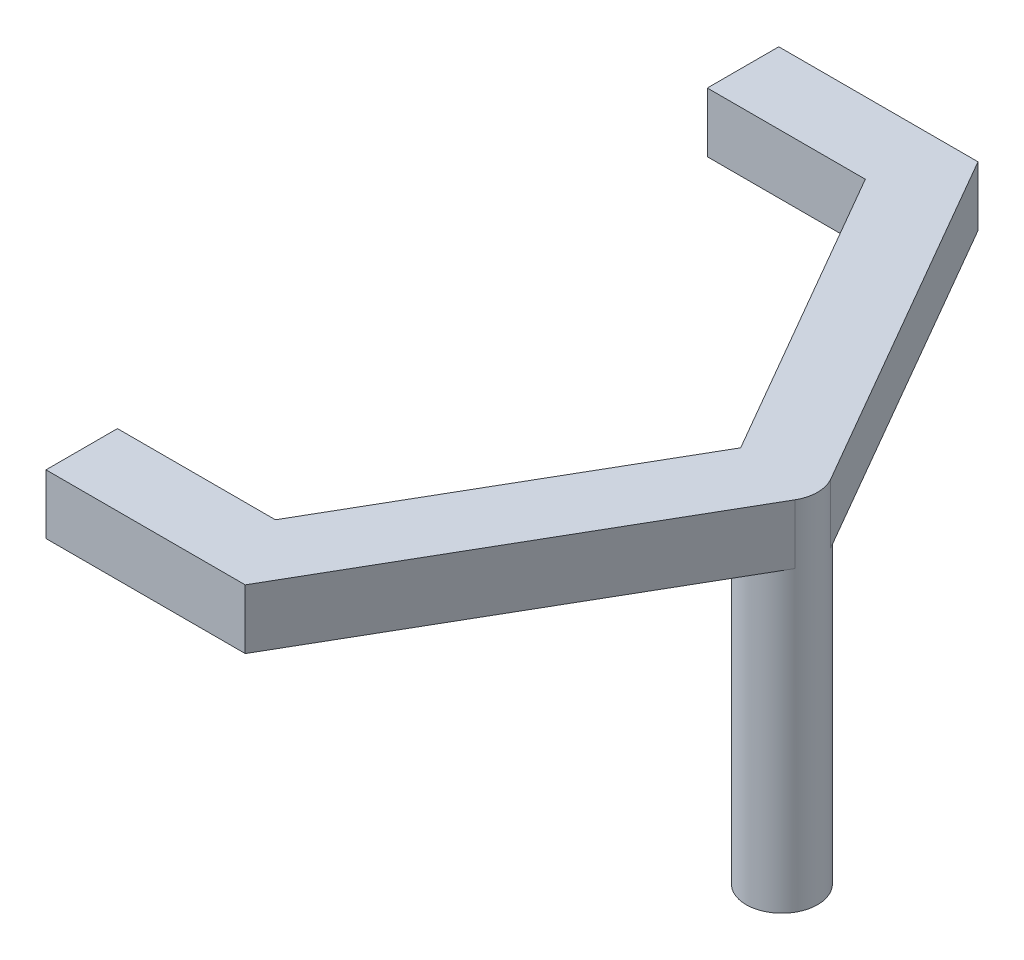
ISO-10303-21;
HEADER;
FILE_DESCRIPTION(('STEP AP214'),'2;1');
FILE_NAME('part.step','',(''),(''),'','','');
FILE_SCHEMA(('AUTOMOTIVE_DESIGN { 1 0 10303 214 1 1 1 1 }'));
ENDSEC;
DATA;
#1=APPLICATION_CONTEXT('core data for automotive mechanical design processes');
#2=APPLICATION_PROTOCOL_DEFINITION('international standard','automotive_design',2000,#1);
#3=PRODUCT_CONTEXT('',#1,'mechanical');
#4=PRODUCT('Part','Part','',(#3));
#5=PRODUCT_RELATED_PRODUCT_CATEGORY('part','',(#4));
#6=PRODUCT_DEFINITION_FORMATION('','',#4);
#7=PRODUCT_DEFINITION_CONTEXT('part definition',#1,'design');
#8=PRODUCT_DEFINITION('design','',#6,#7);
#9=PRODUCT_DEFINITION_SHAPE('','',#8);
#10=(LENGTH_UNIT() NAMED_UNIT(*) SI_UNIT(.MILLI.,.METRE.));
#11=(NAMED_UNIT(*) PLANE_ANGLE_UNIT() SI_UNIT($,.RADIAN.));
#12=(NAMED_UNIT(*) SI_UNIT($,.STERADIAN.) SOLID_ANGLE_UNIT());
#13=UNCERTAINTY_MEASURE_WITH_UNIT(LENGTH_MEASURE(1.E-05),#10,'distance_accuracy_value','');
#14=(GEOMETRIC_REPRESENTATION_CONTEXT(3) GLOBAL_UNCERTAINTY_ASSIGNED_CONTEXT((#13)) GLOBAL_UNIT_ASSIGNED_CONTEXT((#10,
#11,#12)) REPRESENTATION_CONTEXT('',''));
#15=CARTESIAN_POINT('',(0.,0.,0.));
#16=DIRECTION('',(0.,0.,1.));
#17=DIRECTION('',(1.,0.,0.));
#18=AXIS2_PLACEMENT_3D('',#15,#16,#17);
#19=CARTESIAN_POINT('',(-2.59807621135331,25.,1.50000000000001));
#20=DIRECTION('',(-0.866025403784436,0.,0.500000000000004));
#21=DIRECTION('',(0.500000000000004,0.,0.866025403784436));
#22=AXIS2_PLACEMENT_3D('',#19,#20,#21);
#23=PLANE('',#22);
#24=DIRECTION('',(0.500000000000004,0.,0.866025403784436));
#25=VECTOR('',#24,1.);
#26=CARTESIAN_POINT('',(-2.59807621135331,25.,1.50000000000001));
#27=LINE('',#26,#25);
#28=CARTESIAN_POINT('',(-17.765067782965,25.,-24.77));
#29=VERTEX_POINT('',#28);
#30=CARTESIAN_POINT('',(-3.46410161513777,25.,0.));
#31=VERTEX_POINT('',#30);
#32=EDGE_CURVE('E120',#29,#31,#27,.T.);
#33=ORIENTED_EDGE('',*,*,#32,.T.);
#34=DIRECTION('',(0.,1.,0.));
#35=VECTOR('',#34,1.);
#36=CARTESIAN_POINT('',(-3.46410161513777,25.,0.));
#37=LINE('',#36,#35);
#38=CARTESIAN_POINT('',(-3.46410161513777,30.,0.));
#39=VERTEX_POINT('',#38);
#40=EDGE_CURVE('E126',#31,#39,#37,.T.);
#41=ORIENTED_EDGE('',*,*,#40,.T.);
#42=DIRECTION('',(0.500000000000004,0.,0.866025403784436));
#43=VECTOR('',#42,1.);
#44=CARTESIAN_POINT('',(-2.59807621135331,30.,1.50000000000001));
#45=LINE('',#44,#43);
#46=CARTESIAN_POINT('',(-17.765067782965,30.,-24.77));
#47=VERTEX_POINT('',#46);
#48=EDGE_CURVE('E115',#47,#39,#45,.T.);
#49=ORIENTED_EDGE('',*,*,#48,.F.);
#50=DIRECTION('',(0.,1.,0.));
#51=VECTOR('',#50,1.);
#52=CARTESIAN_POINT('',(-17.765067782965,25.,-24.77));
#53=LINE('',#52,#51);
#54=EDGE_CURVE('E52',#29,#47,#53,.T.);
#55=ORIENTED_EDGE('',*,*,#54,.F.);
#56=EDGE_LOOP('',(#33,#41,#49,#55));
#57=FACE_BOUND('',#56,.T.);
#58=ADVANCED_FACE('F35',(#57),#23,.T.);
#59=CARTESIAN_POINT('',(0.,30.,0.));
#60=DIRECTION('',(0.,-1.,0.));
#61=DIRECTION('',(0.,0.,-1.));
#62=AXIS2_PLACEMENT_3D('',#59,#60,#61);
#63=CYLINDRICAL_SURFACE('',#62,3.);
#64=CARTESIAN_POINT('',(0.,30.,0.));
#65=DIRECTION('',(0.,1.,0.));
#66=DIRECTION('',(0.,0.,1.));
#67=AXIS2_PLACEMENT_3D('',#64,#65,#66);
#68=CIRCLE('',#67,3.);
#69=CARTESIAN_POINT('',(2.59807621135331,30.,1.50000000000001));
#70=VERTEX_POINT('',#69);
#71=CARTESIAN_POINT('',(2.59807621135331,30.,-1.50000000000001));
#72=VERTEX_POINT('',#71);
#73=EDGE_CURVE('E44',#70,#72,#68,.T.);
#74=ORIENTED_EDGE('',*,*,#73,.F.);
#75=DIRECTION('',(0.,1.,0.));
#76=VECTOR('',#75,1.);
#77=CARTESIAN_POINT('',(2.59807621135331,25.,1.50000000000001));
#78=LINE('',#77,#76);
#79=CARTESIAN_POINT('',(2.59807621135331,25.,1.50000000000001));
#80=VERTEX_POINT('',#79);
#81=EDGE_CURVE('E178',#80,#70,#78,.T.);
#82=ORIENTED_EDGE('',*,*,#81,.F.);
#83=CARTESIAN_POINT('',(0.,25.,0.));
#84=DIRECTION('',(0.,1.,0.));
#85=DIRECTION('',(0.,0.,1.));
#86=AXIS2_PLACEMENT_3D('',#83,#84,#85);
#87=CIRCLE('',#86,3.);
#88=CARTESIAN_POINT('',(2.59807621135331,25.,-1.50000000000001));
#89=VERTEX_POINT('',#88);
#90=EDGE_CURVE('E11',#89,#80,#87,.T.);
#91=ORIENTED_EDGE('',*,*,#90,.F.);
#92=DIRECTION('',(0.,1.,0.));
#93=VECTOR('',#92,1.);
#94=CARTESIAN_POINT('',(2.59807621135331,25.,-1.50000000000001));
#95=LINE('',#94,#93);
#96=EDGE_CURVE('E85',#89,#72,#95,.T.);
#97=ORIENTED_EDGE('',*,*,#96,.T.);
#98=EDGE_LOOP('',(#74,#82,#91,#97));
#99=FACE_BOUND('',#98,.T.);
#100=CARTESIAN_POINT('',(0.,0.,0.));
#101=DIRECTION('',(0.,1.,0.));
#102=DIRECTION('',(0.,0.,1.));
#103=AXIS2_PLACEMENT_3D('',#100,#101,#102);
#104=CIRCLE('',#103,3.);
#105=CARTESIAN_POINT('',(0.,0.,3.));
#106=VERTEX_POINT('',#105);
#107=EDGE_CURVE('E134',#106,#106,#104,.T.);
#108=ORIENTED_EDGE('',*,*,#107,.T.);
#109=EDGE_LOOP('',(#108));
#110=FACE_BOUND('',#109,.T.);
#111=ADVANCED_FACE('F37',(#99,#110),#63,.T.);
#112=CARTESIAN_POINT('',(0.,30.,0.));
#113=DIRECTION('',(0.,1.,0.));
#114=DIRECTION('',(0.,0.,1.));
#115=AXIS2_PLACEMENT_3D('',#112,#113,#114);
#116=PLANE('',#115);
#117=DIRECTION('',(-0.500000000000004,0.,0.866025403784436));
#118=VECTOR('',#117,1.);
#119=CARTESIAN_POINT('',(2.59807621135331,30.,1.50000000000001));
#120=LINE('',#119,#118);
#121=CARTESIAN_POINT('',(-14.3009661678272,30.,30.77));
#122=VERTEX_POINT('',#121);
#123=EDGE_CURVE('E214',#70,#122,#120,.T.);
#124=ORIENTED_EDGE('',*,*,#123,.F.);
#125=ORIENTED_EDGE('',*,*,#73,.T.);
#126=DIRECTION('',(-0.500000000000004,0.,-0.866025403784436));
#127=VECTOR('',#126,1.);
#128=CARTESIAN_POINT('',(2.59807621135331,30.,-1.50000000000001));
#129=LINE('',#128,#127);
#130=CARTESIAN_POINT('',(-14.3009661678272,30.,-30.77));
#131=VERTEX_POINT('',#130);
#132=EDGE_CURVE('E122',#72,#131,#129,.T.);
#133=ORIENTED_EDGE('',*,*,#132,.T.);
#134=DIRECTION('',(-1.,0.,0.));
#135=VECTOR('',#134,1.);
#136=CARTESIAN_POINT('',(-14.3009661678272,30.,-30.77));
#137=LINE('',#136,#135);
#138=CARTESIAN_POINT('',(-31.0330169753961,30.,-30.77));
#139=VERTEX_POINT('',#138);
#140=EDGE_CURVE('E125',#131,#139,#137,.T.);
#141=ORIENTED_EDGE('',*,*,#140,.T.);
#142=DIRECTION('',(0.,0.,1.));
#143=VECTOR('',#142,1.);
#144=CARTESIAN_POINT('',(-31.0330169753961,30.,-30.77));
#145=LINE('',#144,#143);
#146=CARTESIAN_POINT('',(-31.0330169753961,30.,-24.77));
#147=VERTEX_POINT('',#146);
#148=EDGE_CURVE('E97',#139,#147,#145,.T.);
#149=ORIENTED_EDGE('',*,*,#148,.T.);
#150=DIRECTION('',(1.,0.,0.));
#151=VECTOR('',#150,1.);
#152=CARTESIAN_POINT('',(-17.765067782965,30.,-24.77));
#153=LINE('',#152,#151);
#154=EDGE_CURVE('E129',#147,#47,#153,.T.);
#155=ORIENTED_EDGE('',*,*,#154,.T.);
#156=ORIENTED_EDGE('',*,*,#48,.T.);
#157=DIRECTION('',(0.500000000000004,0.,-0.866025403784436));
#158=VECTOR('',#157,1.);
#159=CARTESIAN_POINT('',(-2.59807621135331,30.,-1.50000000000001));
#160=LINE('',#159,#158);
#161=CARTESIAN_POINT('',(-17.765067782965,30.,24.77));
#162=VERTEX_POINT('',#161);
#163=EDGE_CURVE('E202',#162,#39,#160,.T.);
#164=ORIENTED_EDGE('',*,*,#163,.F.);
#165=DIRECTION('',(1.,0.,0.));
#166=VECTOR('',#165,1.);
#167=CARTESIAN_POINT('',(-17.765067782965,30.,24.77));
#168=LINE('',#167,#166);
#169=CARTESIAN_POINT('',(-31.0330169753961,30.,24.77));
#170=VERTEX_POINT('',#169);
#171=EDGE_CURVE('E205',#170,#162,#168,.T.);
#172=ORIENTED_EDGE('',*,*,#171,.F.);
#173=DIRECTION('',(0.,0.,-1.));
#174=VECTOR('',#173,1.);
#175=CARTESIAN_POINT('',(-31.0330169753961,30.,30.77));
#176=LINE('',#175,#174);
#177=CARTESIAN_POINT('',(-31.0330169753961,30.,30.77));
#178=VERTEX_POINT('',#177);
#179=EDGE_CURVE('E208',#178,#170,#176,.T.);
#180=ORIENTED_EDGE('',*,*,#179,.F.);
#181=DIRECTION('',(-1.,0.,0.));
#182=VECTOR('',#181,1.);
#183=CARTESIAN_POINT('',(-14.3009661678272,30.,30.77));
#184=LINE('',#183,#182);
#185=EDGE_CURVE('E211',#122,#178,#184,.T.);
#186=ORIENTED_EDGE('',*,*,#185,.F.);
#187=EDGE_LOOP('',(#124,#125,#133,#141,#149,#155,#156,#164,#172,#180,#186));
#188=FACE_BOUND('',#187,.T.);
#189=ADVANCED_FACE('F145',(#188),#116,.T.);
#190=CARTESIAN_POINT('',(0.,0.,0.));
#191=DIRECTION('',(0.,1.,0.));
#192=DIRECTION('',(0.,0.,1.));
#193=AXIS2_PLACEMENT_3D('',#190,#191,#192);
#194=PLANE('',#193);
#195=ORIENTED_EDGE('',*,*,#107,.F.);
#196=EDGE_LOOP('',(#195));
#197=FACE_BOUND('',#196,.T.);
#198=ADVANCED_FACE('F142',(#197),#194,.F.);
#199=CARTESIAN_POINT('',(-17.765067782965,25.,-24.77));
#200=DIRECTION('',(0.,0.,1.));
#201=DIRECTION('',(1.,0.,0.));
#202=AXIS2_PLACEMENT_3D('',#199,#200,#201);
#203=PLANE('',#202);
#204=ORIENTED_EDGE('',*,*,#154,.F.);
#205=DIRECTION('',(0.,1.,0.));
#206=VECTOR('',#205,1.);
#207=CARTESIAN_POINT('',(-31.0330169753961,25.,-24.77));
#208=LINE('',#207,#206);
#209=CARTESIAN_POINT('',(-31.0330169753961,25.,-24.77));
#210=VERTEX_POINT('',#209);
#211=EDGE_CURVE('E73',#210,#147,#208,.T.);
#212=ORIENTED_EDGE('',*,*,#211,.F.);
#213=DIRECTION('',(1.,0.,0.));
#214=VECTOR('',#213,1.);
#215=CARTESIAN_POINT('',(-17.765067782965,25.,-24.77));
#216=LINE('',#215,#214);
#217=EDGE_CURVE('E110',#210,#29,#216,.T.);
#218=ORIENTED_EDGE('',*,*,#217,.T.);
#219=ORIENTED_EDGE('',*,*,#54,.T.);
#220=EDGE_LOOP('',(#204,#212,#218,#219));
#221=FACE_BOUND('',#220,.T.);
#222=ADVANCED_FACE('F144',(#221),#203,.T.);
#223=CARTESIAN_POINT('',(-31.0330169753961,25.,-30.77));
#224=DIRECTION('',(-1.,0.,0.));
#225=DIRECTION('',(0.,0.,1.));
#226=AXIS2_PLACEMENT_3D('',#223,#224,#225);
#227=PLANE('',#226);
#228=ORIENTED_EDGE('',*,*,#148,.F.);
#229=DIRECTION('',(0.,1.,0.));
#230=VECTOR('',#229,1.);
#231=CARTESIAN_POINT('',(-31.0330169753961,25.,-30.77));
#232=LINE('',#231,#230);
#233=CARTESIAN_POINT('',(-31.0330169753961,25.,-30.77));
#234=VERTEX_POINT('',#233);
#235=EDGE_CURVE('E92',#234,#139,#232,.T.);
#236=ORIENTED_EDGE('',*,*,#235,.F.);
#237=DIRECTION('',(0.,0.,1.));
#238=VECTOR('',#237,1.);
#239=CARTESIAN_POINT('',(-31.0330169753961,25.,-30.77));
#240=LINE('',#239,#238);
#241=EDGE_CURVE('E95',#234,#210,#240,.T.);
#242=ORIENTED_EDGE('',*,*,#241,.T.);
#243=ORIENTED_EDGE('',*,*,#211,.T.);
#244=EDGE_LOOP('',(#228,#236,#242,#243));
#245=FACE_BOUND('',#244,.T.);
#246=ADVANCED_FACE('F94',(#245),#227,.T.);
#247=CARTESIAN_POINT('',(-14.3009661678272,25.,-30.77));
#248=DIRECTION('',(0.,0.,-1.));
#249=DIRECTION('',(-1.,0.,0.));
#250=AXIS2_PLACEMENT_3D('',#247,#248,#249);
#251=PLANE('',#250);
#252=ORIENTED_EDGE('',*,*,#140,.F.);
#253=DIRECTION('',(0.,1.,0.));
#254=VECTOR('',#253,1.);
#255=CARTESIAN_POINT('',(-14.3009661678272,25.,-30.77));
#256=LINE('',#255,#254);
#257=CARTESIAN_POINT('',(-14.3009661678272,25.,-30.77));
#258=VERTEX_POINT('',#257);
#259=EDGE_CURVE('E102',#258,#131,#256,.T.);
#260=ORIENTED_EDGE('',*,*,#259,.F.);
#261=DIRECTION('',(-1.,0.,0.));
#262=VECTOR('',#261,1.);
#263=CARTESIAN_POINT('',(-14.3009661678272,25.,-30.77));
#264=LINE('',#263,#262);
#265=EDGE_CURVE('E108',#258,#234,#264,.T.);
#266=ORIENTED_EDGE('',*,*,#265,.T.);
#267=ORIENTED_EDGE('',*,*,#235,.T.);
#268=EDGE_LOOP('',(#252,#260,#266,#267));
#269=FACE_BOUND('',#268,.T.);
#270=ADVANCED_FACE('F112',(#269),#251,.T.);
#271=CARTESIAN_POINT('',(2.59807621135331,25.,-1.50000000000001));
#272=DIRECTION('',(0.866025403784436,0.,-0.500000000000004));
#273=DIRECTION('',(-0.500000000000004,0.,-0.866025403784436));
#274=AXIS2_PLACEMENT_3D('',#271,#272,#273);
#275=PLANE('',#274);
#276=ORIENTED_EDGE('',*,*,#132,.F.);
#277=ORIENTED_EDGE('',*,*,#96,.F.);
#278=DIRECTION('',(-0.500000000000004,0.,-0.866025403784436));
#279=VECTOR('',#278,1.);
#280=CARTESIAN_POINT('',(2.59807621135331,25.,-1.50000000000001));
#281=LINE('',#280,#279);
#282=EDGE_CURVE('E113',#89,#258,#281,.T.);
#283=ORIENTED_EDGE('',*,*,#282,.T.);
#284=ORIENTED_EDGE('',*,*,#259,.T.);
#285=EDGE_LOOP('',(#276,#277,#283,#284));
#286=FACE_BOUND('',#285,.T.);
#287=ADVANCED_FACE('F166',(#286),#275,.T.);
#288=CARTESIAN_POINT('',(0.,25.,0.));
#289=DIRECTION('',(0.,1.,0.));
#290=DIRECTION('',(0.,0.,1.));
#291=AXIS2_PLACEMENT_3D('',#288,#289,#290);
#292=PLANE('',#291);
#293=ORIENTED_EDGE('',*,*,#90,.T.);
#294=DIRECTION('',(-0.500000000000004,0.,0.866025403784436));
#295=VECTOR('',#294,1.);
#296=CARTESIAN_POINT('',(2.59807621135331,25.,1.50000000000001));
#297=LINE('',#296,#295);
#298=CARTESIAN_POINT('',(-14.3009661678272,25.,30.77));
#299=VERTEX_POINT('',#298);
#300=EDGE_CURVE('E183',#80,#299,#297,.T.);
#301=ORIENTED_EDGE('',*,*,#300,.T.);
#302=DIRECTION('',(-1.,0.,0.));
#303=VECTOR('',#302,1.);
#304=CARTESIAN_POINT('',(-14.3009661678272,25.,30.77));
#305=LINE('',#304,#303);
#306=CARTESIAN_POINT('',(-31.0330169753961,25.,30.77));
#307=VERTEX_POINT('',#306);
#308=EDGE_CURVE('E193',#299,#307,#305,.T.);
#309=ORIENTED_EDGE('',*,*,#308,.T.);
#310=DIRECTION('',(0.,0.,-1.));
#311=VECTOR('',#310,1.);
#312=CARTESIAN_POINT('',(-31.0330169753961,25.,30.77));
#313=LINE('',#312,#311);
#314=CARTESIAN_POINT('',(-31.0330169753961,25.,24.77));
#315=VERTEX_POINT('',#314);
#316=EDGE_CURVE('E198',#307,#315,#313,.T.);
#317=ORIENTED_EDGE('',*,*,#316,.T.);
#318=DIRECTION('',(1.,0.,0.));
#319=VECTOR('',#318,1.);
#320=CARTESIAN_POINT('',(-17.765067782965,25.,24.77));
#321=LINE('',#320,#319);
#322=CARTESIAN_POINT('',(-17.765067782965,25.,24.77));
#323=VERTEX_POINT('',#322);
#324=EDGE_CURVE('E236',#315,#323,#321,.T.);
#325=ORIENTED_EDGE('',*,*,#324,.T.);
#326=DIRECTION('',(0.500000000000004,0.,-0.866025403784436));
#327=VECTOR('',#326,1.);
#328=CARTESIAN_POINT('',(-2.59807621135331,25.,-1.50000000000001));
#329=LINE('',#328,#327);
#330=EDGE_CURVE('E216',#323,#31,#329,.T.);
#331=ORIENTED_EDGE('',*,*,#330,.T.);
#332=ORIENTED_EDGE('',*,*,#32,.F.);
#333=ORIENTED_EDGE('',*,*,#217,.F.);
#334=ORIENTED_EDGE('',*,*,#241,.F.);
#335=ORIENTED_EDGE('',*,*,#265,.F.);
#336=ORIENTED_EDGE('',*,*,#282,.F.);
#337=EDGE_LOOP('',(#293,#301,#309,#317,#325,#331,#332,#333,#334,#335,#336));
#338=FACE_BOUND('',#337,.T.);
#339=ADVANCED_FACE('F107',(#338),#292,.F.);
#340=CARTESIAN_POINT('',(2.59807621135331,25.,1.50000000000001));
#341=DIRECTION('',(-0.866025403784436,0.,-0.500000000000004));
#342=DIRECTION('',(-0.500000000000004,0.,0.866025403784436));
#343=AXIS2_PLACEMENT_3D('',#340,#341,#342);
#344=PLANE('',#343);
#345=ORIENTED_EDGE('',*,*,#123,.T.);
#346=DIRECTION('',(0.,1.,0.));
#347=VECTOR('',#346,1.);
#348=CARTESIAN_POINT('',(-14.3009661678272,25.,30.77));
#349=LINE('',#348,#347);
#350=EDGE_CURVE('E190',#299,#122,#349,.T.);
#351=ORIENTED_EDGE('',*,*,#350,.F.);
#352=ORIENTED_EDGE('',*,*,#300,.F.);
#353=ORIENTED_EDGE('',*,*,#81,.T.);
#354=EDGE_LOOP('',(#345,#351,#352,#353));
#355=FACE_BOUND('',#354,.T.);
#356=ADVANCED_FACE('F171',(#355),#344,.F.);
#357=CARTESIAN_POINT('',(-14.3009661678272,25.,30.77));
#358=DIRECTION('',(0.,0.,-1.));
#359=DIRECTION('',(-1.,0.,0.));
#360=AXIS2_PLACEMENT_3D('',#357,#358,#359);
#361=PLANE('',#360);
#362=ORIENTED_EDGE('',*,*,#185,.T.);
#363=DIRECTION('',(0.,1.,0.));
#364=VECTOR('',#363,1.);
#365=CARTESIAN_POINT('',(-31.0330169753961,25.,30.77));
#366=LINE('',#365,#364);
#367=EDGE_CURVE('E219',#307,#178,#366,.T.);
#368=ORIENTED_EDGE('',*,*,#367,.F.);
#369=ORIENTED_EDGE('',*,*,#308,.F.);
#370=ORIENTED_EDGE('',*,*,#350,.T.);
#371=EDGE_LOOP('',(#362,#368,#369,#370));
#372=FACE_BOUND('',#371,.T.);
#373=ADVANCED_FACE('F264',(#372),#361,.F.);
#374=CARTESIAN_POINT('',(-31.0330169753961,25.,30.77));
#375=DIRECTION('',(1.,0.,0.));
#376=DIRECTION('',(0.,0.,-1.));
#377=AXIS2_PLACEMENT_3D('',#374,#375,#376);
#378=PLANE('',#377);
#379=ORIENTED_EDGE('',*,*,#179,.T.);
#380=DIRECTION('',(0.,1.,0.));
#381=VECTOR('',#380,1.);
#382=CARTESIAN_POINT('',(-31.0330169753961,25.,24.77));
#383=LINE('',#382,#381);
#384=EDGE_CURVE('E196',#315,#170,#383,.T.);
#385=ORIENTED_EDGE('',*,*,#384,.F.);
#386=ORIENTED_EDGE('',*,*,#316,.F.);
#387=ORIENTED_EDGE('',*,*,#367,.T.);
#388=EDGE_LOOP('',(#379,#385,#386,#387));
#389=FACE_BOUND('',#388,.T.);
#390=ADVANCED_FACE('F247',(#389),#378,.F.);
#391=CARTESIAN_POINT('',(-17.765067782965,25.,24.77));
#392=DIRECTION('',(0.,0.,1.));
#393=DIRECTION('',(1.,0.,0.));
#394=AXIS2_PLACEMENT_3D('',#391,#392,#393);
#395=PLANE('',#394);
#396=ORIENTED_EDGE('',*,*,#171,.T.);
#397=DIRECTION('',(0.,1.,0.));
#398=VECTOR('',#397,1.);
#399=CARTESIAN_POINT('',(-17.765067782965,25.,24.77));
#400=LINE('',#399,#398);
#401=EDGE_CURVE('E192',#323,#162,#400,.T.);
#402=ORIENTED_EDGE('',*,*,#401,.F.);
#403=ORIENTED_EDGE('',*,*,#324,.F.);
#404=ORIENTED_EDGE('',*,*,#384,.T.);
#405=EDGE_LOOP('',(#396,#402,#403,#404));
#406=FACE_BOUND('',#405,.T.);
#407=ADVANCED_FACE('F251',(#406),#395,.F.);
#408=CARTESIAN_POINT('',(-2.59807621135331,25.,-1.50000000000001));
#409=DIRECTION('',(0.866025403784436,0.,0.500000000000004));
#410=DIRECTION('',(0.500000000000004,0.,-0.866025403784436));
#411=AXIS2_PLACEMENT_3D('',#408,#409,#410);
#412=PLANE('',#411);
#413=ORIENTED_EDGE('',*,*,#40,.F.);
#414=ORIENTED_EDGE('',*,*,#330,.F.);
#415=ORIENTED_EDGE('',*,*,#401,.T.);
#416=ORIENTED_EDGE('',*,*,#163,.T.);
#417=EDGE_LOOP('',(#413,#414,#415,#416));
#418=FACE_BOUND('',#417,.T.);
#419=ADVANCED_FACE('F253',(#418),#412,.F.);
#420=CLOSED_SHELL('',(#58,#111,#189,#198,#222,#246,#270,#287,#339,#356,#373,#390,#407,#419));
#421=MANIFOLD_SOLID_BREP('B2',#420);
#422=ADVANCED_BREP_SHAPE_REPRESENTATION('',(#18,#421),#14);
#423=SHAPE_DEFINITION_REPRESENTATION(#9,#422);
ENDSEC;
END-ISO-10303-21;
